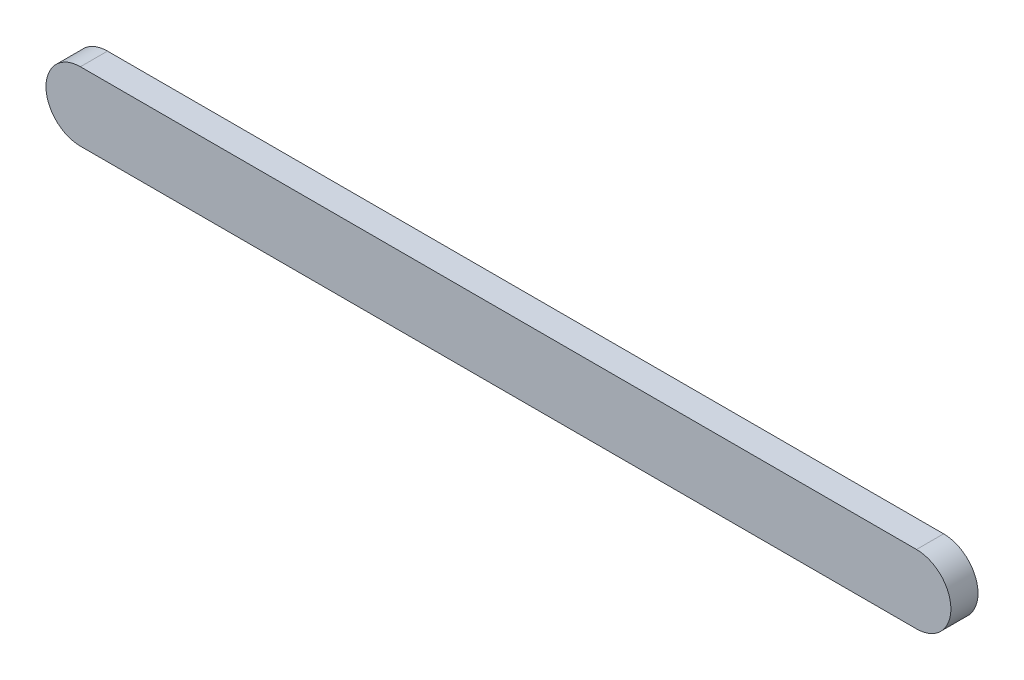
ISO-10303-21;
HEADER;
FILE_DESCRIPTION(('STEP AP214'),'2;1');
FILE_NAME('part.step','',(''),(''),'','','');
FILE_SCHEMA(('AUTOMOTIVE_DESIGN { 1 0 10303 214 1 1 1 1 }'));
ENDSEC;
DATA;
#1=APPLICATION_CONTEXT('core data for automotive mechanical design processes');
#2=APPLICATION_PROTOCOL_DEFINITION('international standard','automotive_design',2000,#1);
#3=PRODUCT_CONTEXT('',#1,'mechanical');
#4=PRODUCT('Part','Part','',(#3));
#5=PRODUCT_RELATED_PRODUCT_CATEGORY('part','',(#4));
#6=PRODUCT_DEFINITION_FORMATION('','',#4);
#7=PRODUCT_DEFINITION_CONTEXT('part definition',#1,'design');
#8=PRODUCT_DEFINITION('design','',#6,#7);
#9=PRODUCT_DEFINITION_SHAPE('','',#8);
#10=(LENGTH_UNIT() NAMED_UNIT(*) SI_UNIT(.MILLI.,.METRE.));
#11=(NAMED_UNIT(*) PLANE_ANGLE_UNIT() SI_UNIT($,.RADIAN.));
#12=(NAMED_UNIT(*) SI_UNIT($,.STERADIAN.) SOLID_ANGLE_UNIT());
#13=UNCERTAINTY_MEASURE_WITH_UNIT(LENGTH_MEASURE(1.E-05),#10,'distance_accuracy_value','');
#14=(GEOMETRIC_REPRESENTATION_CONTEXT(3) GLOBAL_UNCERTAINTY_ASSIGNED_CONTEXT((#13)) GLOBAL_UNIT_ASSIGNED_CONTEXT((#10,
#11,#12)) REPRESENTATION_CONTEXT('',''));
#15=CARTESIAN_POINT('',(0.,0.,0.));
#16=DIRECTION('',(0.,0.,1.));
#17=DIRECTION('',(1.,0.,0.));
#18=AXIS2_PLACEMENT_3D('',#15,#16,#17);
#19=CARTESIAN_POINT('',(110.1598,120.015,0.));
#20=DIRECTION('',(0.,1.,0.));
#21=DIRECTION('',(1.,0.,0.));
#22=AXIS2_PLACEMENT_3D('',#19,#20,#21);
#23=PLANE('',#22);
#24=DIRECTION('',(1.,0.,0.));
#25=VECTOR('',#24,1.);
#26=CARTESIAN_POINT('',(110.1598,120.015,0.1999996));
#27=LINE('',#26,#25);
#28=CARTESIAN_POINT('',(110.1598,120.015,0.1999996));
#29=VERTEX_POINT('',#28);
#30=CARTESIAN_POINT('',(116.332,120.015,0.1999996));
#31=VERTEX_POINT('',#30);
#32=EDGE_CURVE('E11',#29,#31,#27,.T.);
#33=ORIENTED_EDGE('',*,*,#32,.F.);
#34=DIRECTION('',(0.,0.,1.));
#35=VECTOR('',#34,1.);
#36=CARTESIAN_POINT('',(110.1598,120.015,0.));
#37=LINE('',#36,#35);
#38=CARTESIAN_POINT('',(110.1598,120.015,0.));
#39=VERTEX_POINT('',#38);
#40=EDGE_CURVE('E24',#39,#29,#37,.T.);
#41=ORIENTED_EDGE('',*,*,#40,.F.);
#42=DIRECTION('',(1.,0.,0.));
#43=VECTOR('',#42,1.);
#44=CARTESIAN_POINT('',(110.1598,120.015,0.));
#45=LINE('',#44,#43);
#46=CARTESIAN_POINT('',(116.332,120.015,0.));
#47=VERTEX_POINT('',#46);
#48=EDGE_CURVE('E75',#39,#47,#45,.T.);
#49=ORIENTED_EDGE('',*,*,#48,.T.);
#50=DIRECTION('',(0.,0.,1.));
#51=VECTOR('',#50,1.);
#52=CARTESIAN_POINT('',(116.332,120.015,0.));
#53=LINE('',#52,#51);
#54=EDGE_CURVE('E37',#47,#31,#53,.T.);
#55=ORIENTED_EDGE('',*,*,#54,.T.);
#56=EDGE_LOOP('',(#33,#41,#49,#55));
#57=FACE_BOUND('',#56,.T.);
#58=ADVANCED_FACE('F17',(#57),#23,.F.);
#59=CARTESIAN_POINT('',(116.332,120.269,0.));
#60=DIRECTION('',(0.,0.,-1.));
#61=DIRECTION('',(0.,-1.,0.));
#62=AXIS2_PLACEMENT_3D('',#59,#60,#61);
#63=CYLINDRICAL_SURFACE('',#62,0.253999999999995);
#64=CARTESIAN_POINT('',(116.332,120.269,0.1999996));
#65=DIRECTION('',(0.,0.,1.));
#66=DIRECTION('',(0.,-1.,0.));
#67=AXIS2_PLACEMENT_3D('',#64,#65,#66);
#68=CIRCLE('',#67,0.253999999999995);
#69=CARTESIAN_POINT('',(116.332,120.523,0.1999996));
#70=VERTEX_POINT('',#69);
#71=EDGE_CURVE('E83',#31,#70,#68,.T.);
#72=ORIENTED_EDGE('',*,*,#71,.F.);
#73=ORIENTED_EDGE('',*,*,#54,.F.);
#74=CARTESIAN_POINT('',(116.332,120.269,0.));
#75=DIRECTION('',(0.,0.,1.));
#76=DIRECTION('',(0.,-1.,0.));
#77=AXIS2_PLACEMENT_3D('',#74,#75,#76);
#78=CIRCLE('',#77,0.253999999999995);
#79=CARTESIAN_POINT('',(116.332,120.523,0.));
#80=VERTEX_POINT('',#79);
#81=EDGE_CURVE('E81',#47,#80,#78,.T.);
#82=ORIENTED_EDGE('',*,*,#81,.T.);
#83=DIRECTION('',(0.,0.,1.));
#84=VECTOR('',#83,1.);
#85=CARTESIAN_POINT('',(116.332,120.523,0.));
#86=LINE('',#85,#84);
#87=EDGE_CURVE('E67',#80,#70,#86,.T.);
#88=ORIENTED_EDGE('',*,*,#87,.T.);
#89=EDGE_LOOP('',(#72,#73,#82,#88));
#90=FACE_BOUND('',#89,.T.);
#91=ADVANCED_FACE('F89',(#90),#63,.T.);
#92=CARTESIAN_POINT('',(116.332,120.523,0.));
#93=DIRECTION('',(0.,-1.,0.));
#94=DIRECTION('',(-1.,0.,0.));
#95=AXIS2_PLACEMENT_3D('',#92,#93,#94);
#96=PLANE('',#95);
#97=DIRECTION('',(-1.,0.,0.));
#98=VECTOR('',#97,1.);
#99=CARTESIAN_POINT('',(116.332,120.523,0.1999996));
#100=LINE('',#99,#98);
#101=CARTESIAN_POINT('',(110.1598,120.523,0.1999996));
#102=VERTEX_POINT('',#101);
#103=EDGE_CURVE('E71',#70,#102,#100,.T.);
#104=ORIENTED_EDGE('',*,*,#103,.F.);
#105=ORIENTED_EDGE('',*,*,#87,.F.);
#106=DIRECTION('',(-1.,0.,0.));
#107=VECTOR('',#106,1.);
#108=CARTESIAN_POINT('',(116.332,120.523,0.));
#109=LINE('',#108,#107);
#110=CARTESIAN_POINT('',(110.1598,120.523,0.));
#111=VERTEX_POINT('',#110);
#112=EDGE_CURVE('E63',#80,#111,#109,.T.);
#113=ORIENTED_EDGE('',*,*,#112,.T.);
#114=DIRECTION('',(0.,0.,1.));
#115=VECTOR('',#114,1.);
#116=CARTESIAN_POINT('',(110.1598,120.523,0.));
#117=LINE('',#116,#115);
#118=EDGE_CURVE('E53',#111,#102,#117,.T.);
#119=ORIENTED_EDGE('',*,*,#118,.T.);
#120=EDGE_LOOP('',(#104,#105,#113,#119));
#121=FACE_BOUND('',#120,.T.);
#122=ADVANCED_FACE('F66',(#121),#96,.F.);
#123=CARTESIAN_POINT('',(110.1598,120.269,0.));
#124=DIRECTION('',(0.,0.,-1.));
#125=DIRECTION('',(0.,1.,0.));
#126=AXIS2_PLACEMENT_3D('',#123,#124,#125);
#127=CYLINDRICAL_SURFACE('',#126,0.254);
#128=CARTESIAN_POINT('',(110.1598,120.269,0.1999996));
#129=DIRECTION('',(0.,0.,1.));
#130=DIRECTION('',(0.,1.,0.));
#131=AXIS2_PLACEMENT_3D('',#128,#129,#130);
#132=CIRCLE('',#131,0.254);
#133=EDGE_CURVE('E59',#102,#29,#132,.T.);
#134=ORIENTED_EDGE('',*,*,#133,.F.);
#135=ORIENTED_EDGE('',*,*,#118,.F.);
#136=CARTESIAN_POINT('',(110.1598,120.269,0.));
#137=DIRECTION('',(0.,0.,1.));
#138=DIRECTION('',(0.,1.,0.));
#139=AXIS2_PLACEMENT_3D('',#136,#137,#138);
#140=CIRCLE('',#139,0.254);
#141=EDGE_CURVE('E57',#111,#39,#140,.T.);
#142=ORIENTED_EDGE('',*,*,#141,.T.);
#143=ORIENTED_EDGE('',*,*,#40,.T.);
#144=EDGE_LOOP('',(#134,#135,#142,#143));
#145=FACE_BOUND('',#144,.T.);
#146=ADVANCED_FACE('F55',(#145),#127,.T.);
#147=CARTESIAN_POINT('',(110.1598,120.015,0.));
#148=DIRECTION('',(0.,0.,-1.));
#149=DIRECTION('',(-1.,0.,0.));
#150=AXIS2_PLACEMENT_3D('',#147,#148,#149);
#151=PLANE('',#150);
#152=ORIENTED_EDGE('',*,*,#141,.F.);
#153=ORIENTED_EDGE('',*,*,#112,.F.);
#154=ORIENTED_EDGE('',*,*,#81,.F.);
#155=ORIENTED_EDGE('',*,*,#48,.F.);
#156=EDGE_LOOP('',(#152,#153,#154,#155));
#157=FACE_BOUND('',#156,.T.);
#158=ADVANCED_FACE('F74',(#157),#151,.T.);
#159=CARTESIAN_POINT('',(110.1598,120.015,0.1999996));
#160=DIRECTION('',(0.,0.,-1.));
#161=DIRECTION('',(-1.,0.,0.));
#162=AXIS2_PLACEMENT_3D('',#159,#160,#161);
#163=PLANE('',#162);
#164=ORIENTED_EDGE('',*,*,#32,.T.);
#165=ORIENTED_EDGE('',*,*,#71,.T.);
#166=ORIENTED_EDGE('',*,*,#103,.T.);
#167=ORIENTED_EDGE('',*,*,#133,.T.);
#168=EDGE_LOOP('',(#164,#165,#166,#167));
#169=FACE_BOUND('',#168,.T.);
#170=ADVANCED_FACE('F91',(#169),#163,.F.);
#171=CLOSED_SHELL('',(#58,#91,#122,#146,#158,#170));
#172=MANIFOLD_SOLID_BREP('B1',#171);
#173=ADVANCED_BREP_SHAPE_REPRESENTATION('',(#18,#172),#14);
#174=SHAPE_DEFINITION_REPRESENTATION(#9,#173);
ENDSEC;
END-ISO-10303-21;
